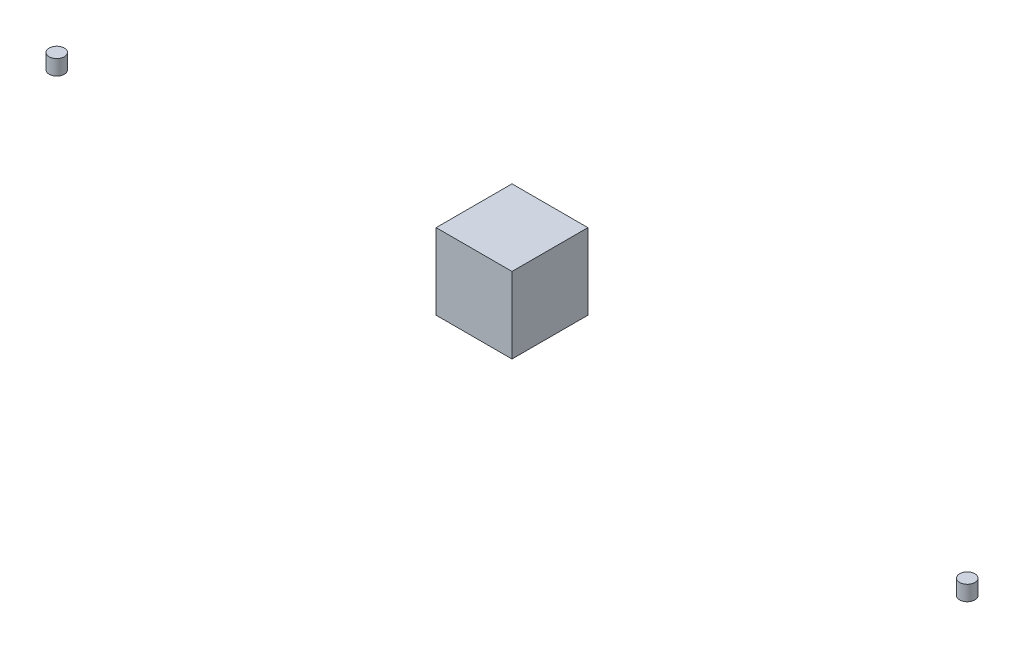
ISO-10303-21;
HEADER;
FILE_DESCRIPTION(('STEP AP214'),'2;1');
FILE_NAME('part.step','',(''),(''),'','','');
FILE_SCHEMA(('AUTOMOTIVE_DESIGN { 1 0 10303 214 1 1 1 1 }'));
ENDSEC;
DATA;
#1=APPLICATION_CONTEXT('core data for automotive mechanical design processes');
#2=APPLICATION_PROTOCOL_DEFINITION('international standard','automotive_design',2000,#1);
#3=PRODUCT_CONTEXT('',#1,'mechanical');
#4=PRODUCT('Part','Part','',(#3));
#5=PRODUCT_RELATED_PRODUCT_CATEGORY('part','',(#4));
#6=PRODUCT_DEFINITION_FORMATION('','',#4);
#7=PRODUCT_DEFINITION_CONTEXT('part definition',#1,'design');
#8=PRODUCT_DEFINITION('design','',#6,#7);
#9=PRODUCT_DEFINITION_SHAPE('','',#8);
#10=(LENGTH_UNIT() NAMED_UNIT(*) SI_UNIT(.MILLI.,.METRE.));
#11=(NAMED_UNIT(*) PLANE_ANGLE_UNIT() SI_UNIT($,.RADIAN.));
#12=(NAMED_UNIT(*) SI_UNIT($,.STERADIAN.) SOLID_ANGLE_UNIT());
#13=UNCERTAINTY_MEASURE_WITH_UNIT(LENGTH_MEASURE(1.E-05),#10,'distance_accuracy_value','');
#14=(GEOMETRIC_REPRESENTATION_CONTEXT(3) GLOBAL_UNCERTAINTY_ASSIGNED_CONTEXT((#13)) GLOBAL_UNIT_ASSIGNED_CONTEXT((#10,
#11,#12)) REPRESENTATION_CONTEXT('',''));
#15=CARTESIAN_POINT('',(0.,0.,0.));
#16=DIRECTION('',(0.,0.,1.));
#17=DIRECTION('',(1.,0.,0.));
#18=AXIS2_PLACEMENT_3D('',#15,#16,#17);
#19=CARTESIAN_POINT('',(300.,-10.,0.));
#20=DIRECTION('',(0.,1.,0.));
#21=DIRECTION('',(0.,0.,1.));
#22=AXIS2_PLACEMENT_3D('',#19,#20,#21);
#23=CYLINDRICAL_SURFACE('',#22,4.99999999999999);
#24=CARTESIAN_POINT('',(300.,-10.,0.));
#25=DIRECTION('',(0.,-1.,0.));
#26=DIRECTION('',(0.,0.,1.));
#27=AXIS2_PLACEMENT_3D('',#24,#25,#26);
#28=CIRCLE('',#27,4.99999999999999);
#29=CARTESIAN_POINT('',(300.,-10.,4.99999999999999));
#30=VERTEX_POINT('',#29);
#31=EDGE_CURVE('E11',#30,#30,#28,.T.);
#32=ORIENTED_EDGE('',*,*,#31,.F.);
#33=EDGE_LOOP('',(#32));
#34=FACE_BOUND('',#33,.T.);
#35=CARTESIAN_POINT('',(300.,0.,0.));
#36=DIRECTION('',(0.,-1.,0.));
#37=DIRECTION('',(0.,0.,1.));
#38=AXIS2_PLACEMENT_3D('',#35,#36,#37);
#39=CIRCLE('',#38,4.99999999999999);
#40=CARTESIAN_POINT('',(300.,0.,4.99999999999999));
#41=VERTEX_POINT('',#40);
#42=EDGE_CURVE('E43',#41,#41,#39,.T.);
#43=ORIENTED_EDGE('',*,*,#42,.T.);
#44=EDGE_LOOP('',(#43));
#45=FACE_BOUND('',#44,.T.);
#46=ADVANCED_FACE('F40',(#34,#45),#23,.T.);
#47=CARTESIAN_POINT('',(300.,-10.,0.));
#48=DIRECTION('',(0.,1.,0.));
#49=DIRECTION('',(0.,0.,1.));
#50=AXIS2_PLACEMENT_3D('',#47,#48,#49);
#51=PLANE('',#50);
#52=ORIENTED_EDGE('',*,*,#31,.T.);
#53=EDGE_LOOP('',(#52));
#54=FACE_BOUND('',#53,.T.);
#55=ADVANCED_FACE('F55',(#54),#51,.F.);
#56=CARTESIAN_POINT('',(300.,0.,0.));
#57=DIRECTION('',(0.,1.,0.));
#58=DIRECTION('',(0.,0.,1.));
#59=AXIS2_PLACEMENT_3D('',#56,#57,#58);
#60=PLANE('',#59);
#61=ORIENTED_EDGE('',*,*,#42,.F.);
#62=EDGE_LOOP('',(#61));
#63=FACE_BOUND('',#62,.T.);
#64=ADVANCED_FACE('F53',(#63),#60,.T.);
#65=CLOSED_SHELL('',(#46,#55,#64));
#66=MANIFOLD_SOLID_BREP('B2',#65);
#67=CARTESIAN_POINT('',(-300.,-10.,0.));
#68=DIRECTION('',(0.,1.,0.));
#69=DIRECTION('',(0.,0.,1.));
#70=AXIS2_PLACEMENT_3D('',#67,#68,#69);
#71=CYLINDRICAL_SURFACE('',#70,4.99999999999999);
#72=CARTESIAN_POINT('',(-300.,-10.,0.));
#73=DIRECTION('',(0.,-1.,0.));
#74=DIRECTION('',(0.,0.,-1.));
#75=AXIS2_PLACEMENT_3D('',#72,#73,#74);
#76=CIRCLE('',#75,4.99999999999999);
#77=CARTESIAN_POINT('',(-300.,-10.,-4.99999999999999));
#78=VERTEX_POINT('',#77);
#79=EDGE_CURVE('E39',#78,#78,#76,.T.);
#80=ORIENTED_EDGE('',*,*,#79,.F.);
#81=EDGE_LOOP('',(#80));
#82=FACE_BOUND('',#81,.T.);
#83=CARTESIAN_POINT('',(-300.,0.,0.));
#84=DIRECTION('',(0.,-1.,0.));
#85=DIRECTION('',(0.,0.,-1.));
#86=AXIS2_PLACEMENT_3D('',#83,#84,#85);
#87=CIRCLE('',#86,4.99999999999999);
#88=CARTESIAN_POINT('',(-300.,0.,-4.99999999999999));
#89=VERTEX_POINT('',#88);
#90=EDGE_CURVE('E93',#89,#89,#87,.T.);
#91=ORIENTED_EDGE('',*,*,#90,.T.);
#92=EDGE_LOOP('',(#91));
#93=FACE_BOUND('',#92,.T.);
#94=ADVANCED_FACE('F90',(#82,#93),#71,.T.);
#95=CARTESIAN_POINT('',(-300.,-10.,0.));
#96=DIRECTION('',(0.,-1.,0.));
#97=DIRECTION('',(0.,0.,-1.));
#98=AXIS2_PLACEMENT_3D('',#95,#96,#97);
#99=PLANE('',#98);
#100=ORIENTED_EDGE('',*,*,#79,.T.);
#101=EDGE_LOOP('',(#100));
#102=FACE_BOUND('',#101,.T.);
#103=ADVANCED_FACE('F105',(#102),#99,.T.);
#104=CARTESIAN_POINT('',(-300.,0.,0.));
#105=DIRECTION('',(0.,-1.,0.));
#106=DIRECTION('',(0.,0.,-1.));
#107=AXIS2_PLACEMENT_3D('',#104,#105,#106);
#108=PLANE('',#107);
#109=ORIENTED_EDGE('',*,*,#90,.F.);
#110=EDGE_LOOP('',(#109));
#111=FACE_BOUND('',#110,.T.);
#112=ADVANCED_FACE('F103',(#111),#108,.F.);
#113=CLOSED_SHELL('',(#94,#103,#112));
#114=MANIFOLD_SOLID_BREP('B6',#113);
#115=CARTESIAN_POINT('',(-25.,50.,25.));
#116=DIRECTION('',(1.,0.,0.));
#117=DIRECTION('',(0.,0.,-1.));
#118=AXIS2_PLACEMENT_3D('',#115,#116,#117);
#119=PLANE('',#118);
#120=CARTESIAN_POINT('',(-25.,25.,0.));
#121=DIRECTION('',(1.,0.,0.));
#122=DIRECTION('',(0.,0.,-1.));
#123=AXIS2_PLACEMENT_3D('',#120,#121,#122);
#124=CIRCLE('',#123,5.);
#125=CARTESIAN_POINT('',(-25.,25.,-5.));
#126=VERTEX_POINT('',#125);
#127=EDGE_CURVE('E88',#126,#126,#124,.F.);
#128=ORIENTED_EDGE('',*,*,#127,.F.);
#129=EDGE_LOOP('',(#128));
#130=FACE_BOUND('',#129,.T.);
#131=DIRECTION('',(0.,0.,1.));
#132=VECTOR('',#131,1.);
#133=CARTESIAN_POINT('',(-25.,0.,25.));
#134=LINE('',#133,#132);
#135=CARTESIAN_POINT('',(-25.,0.,-25.));
#136=VERTEX_POINT('',#135);
#137=CARTESIAN_POINT('',(-25.,0.,25.));
#138=VERTEX_POINT('',#137);
#139=EDGE_CURVE('E197',#136,#138,#134,.T.);
#140=ORIENTED_EDGE('',*,*,#139,.T.);
#141=DIRECTION('',(0.,-1.,0.));
#142=VECTOR('',#141,1.);
#143=CARTESIAN_POINT('',(-25.,50.,25.));
#144=LINE('',#143,#142);
#145=CARTESIAN_POINT('',(-25.,50.,25.));
#146=VERTEX_POINT('',#145);
#147=EDGE_CURVE('E139',#146,#138,#144,.T.);
#148=ORIENTED_EDGE('',*,*,#147,.F.);
#149=DIRECTION('',(0.,0.,1.));
#150=VECTOR('',#149,1.);
#151=CARTESIAN_POINT('',(-25.,50.,25.));
#152=LINE('',#151,#150);
#153=CARTESIAN_POINT('',(-25.,50.,-25.));
#154=VERTEX_POINT('',#153);
#155=EDGE_CURVE('E183',#154,#146,#152,.T.);
#156=ORIENTED_EDGE('',*,*,#155,.F.);
#157=DIRECTION('',(0.,-1.,0.));
#158=VECTOR('',#157,1.);
#159=CARTESIAN_POINT('',(-25.,50.,-25.));
#160=LINE('',#159,#158);
#161=EDGE_CURVE('E193',#154,#136,#160,.T.);
#162=ORIENTED_EDGE('',*,*,#161,.T.);
#163=EDGE_LOOP('',(#140,#148,#156,#162));
#164=FACE_BOUND('',#163,.T.);
#165=ADVANCED_FACE('F131',(#130,#164),#119,.F.);
#166=CARTESIAN_POINT('',(25.,50.,25.));
#167=DIRECTION('',(0.,0.,-1.));
#168=DIRECTION('',(-1.,0.,0.));
#169=AXIS2_PLACEMENT_3D('',#166,#167,#168);
#170=PLANE('',#169);
#171=DIRECTION('',(1.,0.,0.));
#172=VECTOR('',#171,1.);
#173=CARTESIAN_POINT('',(25.,0.,25.));
#174=LINE('',#173,#172);
#175=CARTESIAN_POINT('',(25.,0.,25.));
#176=VERTEX_POINT('',#175);
#177=EDGE_CURVE('E188',#138,#176,#174,.T.);
#178=ORIENTED_EDGE('',*,*,#177,.T.);
#179=DIRECTION('',(0.,-1.,0.));
#180=VECTOR('',#179,1.);
#181=CARTESIAN_POINT('',(25.,50.,25.));
#182=LINE('',#181,#180);
#183=CARTESIAN_POINT('',(25.,50.,25.));
#184=VERTEX_POINT('',#183);
#185=EDGE_CURVE('E186',#184,#176,#182,.T.);
#186=ORIENTED_EDGE('',*,*,#185,.F.);
#187=DIRECTION('',(1.,0.,0.));
#188=VECTOR('',#187,1.);
#189=CARTESIAN_POINT('',(25.,50.,25.));
#190=LINE('',#189,#188);
#191=EDGE_CURVE('E178',#146,#184,#190,.T.);
#192=ORIENTED_EDGE('',*,*,#191,.F.);
#193=ORIENTED_EDGE('',*,*,#147,.T.);
#194=EDGE_LOOP('',(#178,#186,#192,#193));
#195=FACE_BOUND('',#194,.T.);
#196=ADVANCED_FACE('F187',(#195),#170,.F.);
#197=CARTESIAN_POINT('',(25.,50.,25.));
#198=DIRECTION('',(-1.,0.,0.));
#199=DIRECTION('',(0.,0.,1.));
#200=AXIS2_PLACEMENT_3D('',#197,#198,#199);
#201=PLANE('',#200);
#202=DIRECTION('',(0.,0.,-1.));
#203=VECTOR('',#202,1.);
#204=CARTESIAN_POINT('',(25.,0.,25.));
#205=LINE('',#204,#203);
#206=CARTESIAN_POINT('',(25.,0.,-25.));
#207=VERTEX_POINT('',#206);
#208=EDGE_CURVE('E164',#176,#207,#205,.T.);
#209=ORIENTED_EDGE('',*,*,#208,.T.);
#210=DIRECTION('',(0.,-1.,0.));
#211=VECTOR('',#210,1.);
#212=CARTESIAN_POINT('',(25.,50.,-25.));
#213=LINE('',#212,#211);
#214=CARTESIAN_POINT('',(25.,50.,-25.));
#215=VERTEX_POINT('',#214);
#216=EDGE_CURVE('E189',#215,#207,#213,.T.);
#217=ORIENTED_EDGE('',*,*,#216,.F.);
#218=DIRECTION('',(0.,0.,-1.));
#219=VECTOR('',#218,1.);
#220=CARTESIAN_POINT('',(25.,50.,25.));
#221=LINE('',#220,#219);
#222=EDGE_CURVE('E181',#184,#215,#221,.T.);
#223=ORIENTED_EDGE('',*,*,#222,.F.);
#224=ORIENTED_EDGE('',*,*,#185,.T.);
#225=EDGE_LOOP('',(#209,#217,#223,#224));
#226=FACE_BOUND('',#225,.T.);
#227=ADVANCED_FACE('F191',(#226),#201,.F.);
#228=CARTESIAN_POINT('',(25.,50.,-25.));
#229=DIRECTION('',(0.,0.,1.));
#230=DIRECTION('',(1.,0.,0.));
#231=AXIS2_PLACEMENT_3D('',#228,#229,#230);
#232=PLANE('',#231);
#233=DIRECTION('',(-1.,0.,0.));
#234=VECTOR('',#233,1.);
#235=CARTESIAN_POINT('',(25.,0.,-25.));
#236=LINE('',#235,#234);
#237=EDGE_CURVE('E170',#207,#136,#236,.T.);
#238=ORIENTED_EDGE('',*,*,#237,.T.);
#239=ORIENTED_EDGE('',*,*,#161,.F.);
#240=DIRECTION('',(-1.,0.,0.));
#241=VECTOR('',#240,1.);
#242=CARTESIAN_POINT('',(25.,50.,-25.));
#243=LINE('',#242,#241);
#244=EDGE_CURVE('E147',#215,#154,#243,.T.);
#245=ORIENTED_EDGE('',*,*,#244,.F.);
#246=ORIENTED_EDGE('',*,*,#216,.T.);
#247=EDGE_LOOP('',(#238,#239,#245,#246));
#248=FACE_BOUND('',#247,.T.);
#249=ADVANCED_FACE('F219',(#248),#232,.F.);
#250=CARTESIAN_POINT('',(0.,50.,0.));
#251=DIRECTION('',(0.,1.,0.));
#252=DIRECTION('',(0.,0.,1.));
#253=AXIS2_PLACEMENT_3D('',#250,#251,#252);
#254=PLANE('',#253);
#255=ORIENTED_EDGE('',*,*,#155,.T.);
#256=ORIENTED_EDGE('',*,*,#191,.T.);
#257=ORIENTED_EDGE('',*,*,#222,.T.);
#258=ORIENTED_EDGE('',*,*,#244,.T.);
#259=EDGE_LOOP('',(#255,#256,#257,#258));
#260=FACE_BOUND('',#259,.T.);
#261=ADVANCED_FACE('F179',(#260),#254,.T.);
#262=CARTESIAN_POINT('',(0.,0.,0.));
#263=DIRECTION('',(0.,1.,0.));
#264=DIRECTION('',(0.,0.,1.));
#265=AXIS2_PLACEMENT_3D('',#262,#263,#264);
#266=PLANE('',#265);
#267=ORIENTED_EDGE('',*,*,#139,.F.);
#268=ORIENTED_EDGE('',*,*,#237,.F.);
#269=ORIENTED_EDGE('',*,*,#208,.F.);
#270=ORIENTED_EDGE('',*,*,#177,.F.);
#271=EDGE_LOOP('',(#267,#268,#269,#270));
#272=FACE_BOUND('',#271,.T.);
#273=ADVANCED_FACE('F208',(#272),#266,.F.);
#274=CARTESIAN_POINT('',(-35.,25.,0.));
#275=DIRECTION('',(1.,0.,0.));
#276=DIRECTION('',(0.,0.,-1.));
#277=AXIS2_PLACEMENT_3D('',#274,#275,#276);
#278=CYLINDRICAL_SURFACE('',#277,5.);
#279=CARTESIAN_POINT('',(-35.,25.,0.));
#280=DIRECTION('',(-1.,0.,0.));
#281=DIRECTION('',(0.,0.,1.));
#282=AXIS2_PLACEMENT_3D('',#279,#280,#281);
#283=CIRCLE('',#282,5.);
#284=CARTESIAN_POINT('',(-35.,25.,5.));
#285=VERTEX_POINT('',#284);
#286=EDGE_CURVE('E200',#285,#285,#283,.T.);
#287=ORIENTED_EDGE('',*,*,#286,.F.);
#288=EDGE_LOOP('',(#287));
#289=FACE_BOUND('',#288,.T.);
#290=ORIENTED_EDGE('',*,*,#127,.T.);
#291=EDGE_LOOP('',(#290));
#292=FACE_BOUND('',#291,.T.);
#293=ADVANCED_FACE('F210',(#289,#292),#278,.T.);
#294=CARTESIAN_POINT('',(-35.,25.,0.));
#295=DIRECTION('',(-1.,0.,0.));
#296=DIRECTION('',(0.,0.,1.));
#297=AXIS2_PLACEMENT_3D('',#294,#295,#296);
#298=PLANE('',#297);
#299=ORIENTED_EDGE('',*,*,#286,.T.);
#300=EDGE_LOOP('',(#299));
#301=FACE_BOUND('',#300,.T.);
#302=ADVANCED_FACE('F216',(#301),#298,.T.);
#303=CLOSED_SHELL('',(#165,#196,#227,#249,#261,#273,#293,#302));
#304=MANIFOLD_SOLID_BREP('B34',#303);
#305=ADVANCED_BREP_SHAPE_REPRESENTATION('',(#18,#66,#114,#304),#14);
#306=SHAPE_DEFINITION_REPRESENTATION(#9,#305);
ENDSEC;
END-ISO-10303-21;
